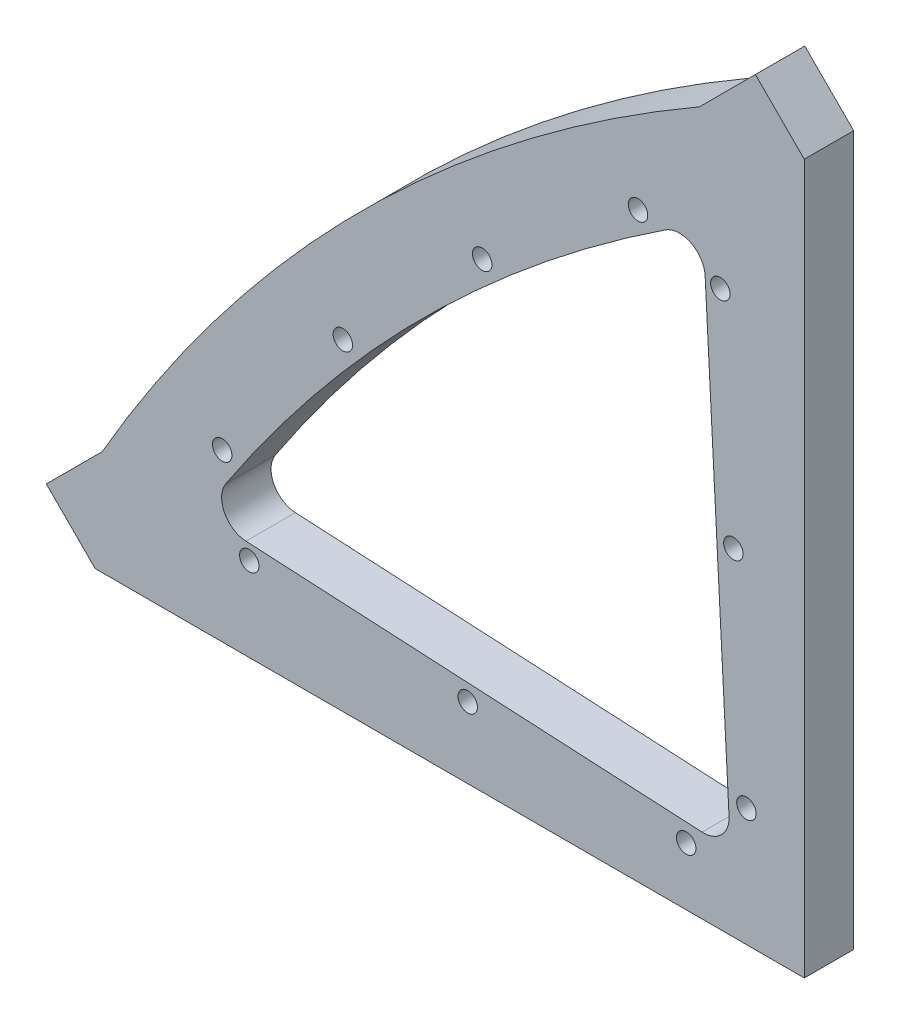
ISO-10303-21;
HEADER;
FILE_DESCRIPTION(('STEP AP214'),'2;1');
FILE_NAME('part.step','',(''),(''),'','','');
FILE_SCHEMA(('AUTOMOTIVE_DESIGN { 1 0 10303 214 1 1 1 1 }'));
ENDSEC;
DATA;
#1=APPLICATION_CONTEXT('core data for automotive mechanical design processes');
#2=APPLICATION_PROTOCOL_DEFINITION('international standard','automotive_design',2000,#1);
#3=PRODUCT_CONTEXT('',#1,'mechanical');
#4=PRODUCT('Part','Part','',(#3));
#5=PRODUCT_RELATED_PRODUCT_CATEGORY('part','',(#4));
#6=PRODUCT_DEFINITION_FORMATION('','',#4);
#7=PRODUCT_DEFINITION_CONTEXT('part definition',#1,'design');
#8=PRODUCT_DEFINITION('design','',#6,#7);
#9=PRODUCT_DEFINITION_SHAPE('','',#8);
#10=(LENGTH_UNIT() NAMED_UNIT(*) SI_UNIT(.MILLI.,.METRE.));
#11=(NAMED_UNIT(*) PLANE_ANGLE_UNIT() SI_UNIT($,.RADIAN.));
#12=(NAMED_UNIT(*) SI_UNIT($,.STERADIAN.) SOLID_ANGLE_UNIT());
#13=UNCERTAINTY_MEASURE_WITH_UNIT(LENGTH_MEASURE(1.E-05),#10,'distance_accuracy_value','');
#14=(GEOMETRIC_REPRESENTATION_CONTEXT(3) GLOBAL_UNCERTAINTY_ASSIGNED_CONTEXT((#13)) GLOBAL_UNIT_ASSIGNED_CONTEXT((#10,
#11,#12)) REPRESENTATION_CONTEXT('',''));
#15=CARTESIAN_POINT('',(0.,0.,0.));
#16=DIRECTION('',(0.,0.,1.));
#17=DIRECTION('',(1.,0.,0.));
#18=AXIS2_PLACEMENT_3D('',#15,#16,#17);
#19=CARTESIAN_POINT('',(109.464422667226,108.781938142239,12.7));
#20=DIRECTION('',(-0.707106781186546,-0.707106781186549,0.));
#21=DIRECTION('',(0.707106781186549,-0.707106781186546,0.));
#22=AXIS2_PLACEMENT_3D('',#19,#20,#21);
#23=PLANE('',#22);
#24=DIRECTION('',(-0.707106781186549,0.707106781186546,0.));
#25=VECTOR('',#24,1.);
#26=CARTESIAN_POINT('',(109.464422667226,108.781938142239,0.));
#27=LINE('',#26,#25);
#28=CARTESIAN_POINT('',(122.036781236723,96.2095795727423,0.));
#29=VERTEX_POINT('',#28);
#30=CARTESIAN_POINT('',(109.464422667226,108.781938142239,0.));
#31=VERTEX_POINT('',#30);
#32=EDGE_CURVE('E182',#29,#31,#27,.T.);
#33=ORIENTED_EDGE('',*,*,#32,.T.);
#34=DIRECTION('',(0.,0.,-1.));
#35=VECTOR('',#34,1.);
#36=CARTESIAN_POINT('',(109.464422667226,108.781938142239,12.7));
#37=LINE('',#36,#35);
#38=CARTESIAN_POINT('',(109.464422667226,108.781938142239,12.7));
#39=VERTEX_POINT('',#38);
#40=EDGE_CURVE('E11',#39,#31,#37,.T.);
#41=ORIENTED_EDGE('',*,*,#40,.F.);
#42=DIRECTION('',(-0.707106781186549,0.707106781186546,0.));
#43=VECTOR('',#42,1.);
#44=CARTESIAN_POINT('',(109.464422667226,108.781938142239,12.7));
#45=LINE('',#44,#43);
#46=CARTESIAN_POINT('',(122.036781236723,96.2095795727423,12.7));
#47=VERTEX_POINT('',#46);
#48=EDGE_CURVE('E190',#47,#39,#45,.T.);
#49=ORIENTED_EDGE('',*,*,#48,.F.);
#50=DIRECTION('',(0.,0.,-1.));
#51=VECTOR('',#50,1.);
#52=CARTESIAN_POINT('',(122.036781236723,96.2095795727423,12.7));
#53=LINE('',#52,#51);
#54=EDGE_CURVE('E206',#47,#29,#53,.T.);
#55=ORIENTED_EDGE('',*,*,#54,.T.);
#56=EDGE_LOOP('',(#33,#41,#49,#55));
#57=FACE_BOUND('',#56,.T.);
#58=ADVANCED_FACE('F39',(#57),#23,.F.);
#59=CARTESIAN_POINT('',(95.0960128735152,94.4135283485285,12.7));
#60=DIRECTION('',(0.707106781186548,-0.707106781186548,0.));
#61=DIRECTION('',(0.707106781186548,0.707106781186548,0.));
#62=AXIS2_PLACEMENT_3D('',#59,#60,#61);
#63=PLANE('',#62);
#64=DIRECTION('',(-0.707106781186547,-0.707106781186547,0.));
#65=VECTOR('',#64,1.);
#66=CARTESIAN_POINT('',(95.0960128735152,94.4135283485285,0.));
#67=LINE('',#66,#65);
#68=CARTESIAN_POINT('',(95.0960128735152,94.4135283485285,0.));
#69=VERTEX_POINT('',#68);
#70=EDGE_CURVE('E209',#31,#69,#67,.T.);
#71=ORIENTED_EDGE('',*,*,#70,.T.);
#72=DIRECTION('',(0.,0.,-1.));
#73=VECTOR('',#72,1.);
#74=CARTESIAN_POINT('',(95.0960128735152,94.4135283485285,12.7));
#75=LINE('',#74,#73);
#76=CARTESIAN_POINT('',(95.0960128735152,94.4135283485285,12.7));
#77=VERTEX_POINT('',#76);
#78=EDGE_CURVE('E46',#77,#69,#75,.T.);
#79=ORIENTED_EDGE('',*,*,#78,.F.);
#80=DIRECTION('',(-0.707106781186547,-0.707106781186547,0.));
#81=VECTOR('',#80,1.);
#82=CARTESIAN_POINT('',(95.0960128735152,94.4135283485285,12.7));
#83=LINE('',#82,#81);
#84=EDGE_CURVE('E193',#39,#77,#83,.T.);
#85=ORIENTED_EDGE('',*,*,#84,.F.);
#86=ORIENTED_EDGE('',*,*,#40,.T.);
#87=EDGE_LOOP('',(#71,#79,#85,#86));
#88=FACE_BOUND('',#87,.T.);
#89=ADVANCED_FACE('F259',(#88),#63,.F.);
#90=CARTESIAN_POINT('',(304.254749985464,-268.307588433703,12.7));
#91=DIRECTION('',(0.,0.,-1.));
#92=DIRECTION('',(-1.,0.,0.));
#93=AXIS2_PLACEMENT_3D('',#90,#91,#92);
#94=CYLINDRICAL_SURFACE('',#93,418.705129978144);
#95=CARTESIAN_POINT('',(304.254749985464,-268.307588433703,0.));
#96=DIRECTION('',(0.,0.,1.));
#97=DIRECTION('',(1.,0.,0.));
#98=AXIS2_PLACEMENT_3D('',#95,#96,#97);
#99=CIRCLE('',#98,418.705129978144);
#100=CARTESIAN_POINT('',(-58.4663667967675,-59.1488513217542,0.));
#101=VERTEX_POINT('',#100);
#102=EDGE_CURVE('E211',#69,#101,#99,.T.);
#103=ORIENTED_EDGE('',*,*,#102,.T.);
#104=DIRECTION('',(0.,0.,-1.));
#105=VECTOR('',#104,1.);
#106=CARTESIAN_POINT('',(-58.4663667967675,-59.1488513217542,12.7));
#107=LINE('',#106,#105);
#108=CARTESIAN_POINT('',(-58.4663667967675,-59.1488513217542,12.7));
#109=VERTEX_POINT('',#108);
#110=EDGE_CURVE('E231',#109,#101,#107,.T.);
#111=ORIENTED_EDGE('',*,*,#110,.F.);
#112=CARTESIAN_POINT('',(304.254749985464,-268.307588433703,12.7));
#113=DIRECTION('',(0.,0.,1.));
#114=DIRECTION('',(1.,0.,0.));
#115=AXIS2_PLACEMENT_3D('',#112,#113,#114);
#116=CIRCLE('',#115,418.705129978144);
#117=EDGE_CURVE('E196',#77,#109,#116,.T.);
#118=ORIENTED_EDGE('',*,*,#117,.F.);
#119=ORIENTED_EDGE('',*,*,#78,.T.);
#120=EDGE_LOOP('',(#103,#111,#118,#119));
#121=FACE_BOUND('',#120,.T.);
#122=ADVANCED_FACE('F238',(#121),#94,.T.);
#123=CARTESIAN_POINT('',(-58.4663667967675,-59.1488513217543,12.7));
#124=DIRECTION('',(0.707106781186548,-0.707106781186548,0.));
#125=DIRECTION('',(0.707106781186548,0.707106781186548,0.));
#126=AXIS2_PLACEMENT_3D('',#123,#124,#125);
#127=PLANE('',#126);
#128=DIRECTION('',(-0.707106781186548,-0.707106781186548,0.));
#129=VECTOR('',#128,1.);
#130=CARTESIAN_POINT('',(-58.4663667967675,-59.1488513217543,0.));
#131=LINE('',#130,#129);
#132=CARTESIAN_POINT('',(-72.8347765904782,-73.5172611154649,0.));
#133=VERTEX_POINT('',#132);
#134=EDGE_CURVE('E213',#101,#133,#131,.T.);
#135=ORIENTED_EDGE('',*,*,#134,.T.);
#136=DIRECTION('',(0.,0.,-1.));
#137=VECTOR('',#136,1.);
#138=CARTESIAN_POINT('',(-72.8347765904782,-73.5172611154649,12.7));
#139=LINE('',#138,#137);
#140=CARTESIAN_POINT('',(-72.8347765904782,-73.5172611154649,12.7));
#141=VERTEX_POINT('',#140);
#142=EDGE_CURVE('E228',#141,#133,#139,.T.);
#143=ORIENTED_EDGE('',*,*,#142,.F.);
#144=DIRECTION('',(-0.707106781186548,-0.707106781186548,0.));
#145=VECTOR('',#144,1.);
#146=CARTESIAN_POINT('',(-58.4663667967675,-59.1488513217543,12.7));
#147=LINE('',#146,#145);
#148=EDGE_CURVE('E198',#109,#141,#147,.T.);
#149=ORIENTED_EDGE('',*,*,#148,.F.);
#150=ORIENTED_EDGE('',*,*,#110,.T.);
#151=EDGE_LOOP('',(#135,#143,#149,#150));
#152=FACE_BOUND('',#151,.T.);
#153=ADVANCED_FACE('F247',(#152),#127,.F.);
#154=CARTESIAN_POINT('',(-72.8347765904782,-73.5172611154649,12.7));
#155=DIRECTION('',(0.707106781186548,0.707106781186548,0.));
#156=DIRECTION('',(-0.707106781186548,0.707106781186548,0.));
#157=AXIS2_PLACEMENT_3D('',#154,#155,#156);
#158=PLANE('',#157);
#159=DIRECTION('',(0.707106781186548,-0.707106781186548,0.));
#160=VECTOR('',#159,1.);
#161=CARTESIAN_POINT('',(-72.8347765904782,-73.5172611154649,0.));
#162=LINE('',#161,#160);
#163=CARTESIAN_POINT('',(-60.2624180209813,-86.0896196849618,0.));
#164=VERTEX_POINT('',#163);
#165=EDGE_CURVE('E215',#133,#164,#162,.T.);
#166=ORIENTED_EDGE('',*,*,#165,.T.);
#167=DIRECTION('',(0.,0.,-1.));
#168=VECTOR('',#167,1.);
#169=CARTESIAN_POINT('',(-60.2624180209813,-86.0896196849618,12.7));
#170=LINE('',#169,#168);
#171=CARTESIAN_POINT('',(-60.2624180209813,-86.0896196849618,12.7));
#172=VERTEX_POINT('',#171);
#173=EDGE_CURVE('E225',#172,#164,#170,.T.);
#174=ORIENTED_EDGE('',*,*,#173,.F.);
#175=DIRECTION('',(0.707106781186548,-0.707106781186548,0.));
#176=VECTOR('',#175,1.);
#177=CARTESIAN_POINT('',(-72.8347765904782,-73.5172611154649,12.7));
#178=LINE('',#177,#176);
#179=EDGE_CURVE('E200',#141,#172,#178,.T.);
#180=ORIENTED_EDGE('',*,*,#179,.F.);
#181=ORIENTED_EDGE('',*,*,#142,.T.);
#182=EDGE_LOOP('',(#166,#174,#180,#181));
#183=FACE_BOUND('',#182,.T.);
#184=ADVANCED_FACE('F251',(#183),#158,.F.);
#185=CARTESIAN_POINT('',(-60.2624180209813,-86.0896196849618,12.7));
#186=DIRECTION('',(0.,1.,0.));
#187=DIRECTION('',(0.,0.,1.));
#188=AXIS2_PLACEMENT_3D('',#185,#186,#187);
#189=PLANE('',#188);
#190=DIRECTION('',(1.,0.,0.));
#191=VECTOR('',#190,1.);
#192=CARTESIAN_POINT('',(-60.2624180209813,-86.0896196849618,0.));
#193=LINE('',#192,#191);
#194=CARTESIAN_POINT('',(122.036781236723,-86.0896196849618,0.));
#195=VERTEX_POINT('',#194);
#196=EDGE_CURVE('E217',#164,#195,#193,.T.);
#197=ORIENTED_EDGE('',*,*,#196,.T.);
#198=DIRECTION('',(0.,0.,-1.));
#199=VECTOR('',#198,1.);
#200=CARTESIAN_POINT('',(122.036781236723,-86.0896196849618,12.7));
#201=LINE('',#200,#199);
#202=CARTESIAN_POINT('',(122.036781236723,-86.0896196849618,12.7));
#203=VERTEX_POINT('',#202);
#204=EDGE_CURVE('E222',#203,#195,#201,.T.);
#205=ORIENTED_EDGE('',*,*,#204,.F.);
#206=DIRECTION('',(1.,0.,0.));
#207=VECTOR('',#206,1.);
#208=CARTESIAN_POINT('',(-60.2624180209813,-86.0896196849618,12.7));
#209=LINE('',#208,#207);
#210=EDGE_CURVE('E202',#172,#203,#209,.T.);
#211=ORIENTED_EDGE('',*,*,#210,.F.);
#212=ORIENTED_EDGE('',*,*,#173,.T.);
#213=EDGE_LOOP('',(#197,#205,#211,#212));
#214=FACE_BOUND('',#213,.T.);
#215=ADVANCED_FACE('F267',(#214),#189,.F.);
#216=CARTESIAN_POINT('',(122.036781236723,96.2095795727423,12.7));
#217=DIRECTION('',(-1.,0.,0.));
#218=DIRECTION('',(0.,-1.,0.));
#219=AXIS2_PLACEMENT_3D('',#216,#217,#218);
#220=PLANE('',#219);
#221=DIRECTION('',(0.,1.,0.));
#222=VECTOR('',#221,1.);
#223=CARTESIAN_POINT('',(122.036781236723,96.2095795727423,0.));
#224=LINE('',#223,#222);
#225=EDGE_CURVE('E194',#195,#29,#224,.T.);
#226=ORIENTED_EDGE('',*,*,#225,.T.);
#227=ORIENTED_EDGE('',*,*,#54,.F.);
#228=DIRECTION('',(0.,1.,0.));
#229=VECTOR('',#228,1.);
#230=CARTESIAN_POINT('',(122.036781236723,96.2095795727423,12.7));
#231=LINE('',#230,#229);
#232=EDGE_CURVE('E204',#203,#47,#231,.T.);
#233=ORIENTED_EDGE('',*,*,#232,.F.);
#234=ORIENTED_EDGE('',*,*,#204,.T.);
#235=EDGE_LOOP('',(#226,#227,#233,#234));
#236=FACE_BOUND('',#235,.T.);
#237=ADVANCED_FACE('F264',(#236),#220,.F.);
#238=CARTESIAN_POINT('',(304.254749985464,-268.307588433703,12.7));
#239=DIRECTION('',(0.,0.,1.));
#240=DIRECTION('',(1.,0.,0.));
#241=AXIS2_PLACEMENT_3D('',#238,#239,#240);
#242=PLANE('',#241);
#243=CARTESIAN_POINT('',(79.2876035932814,63.568690871037,12.7));
#244=DIRECTION('',(0.,0.,-1.));
#245=DIRECTION('',(-1.,0.,0.));
#246=AXIS2_PLACEMENT_3D('',#243,#244,#245);
#247=CIRCLE('',#246,2.50000000000001);
#248=CARTESIAN_POINT('',(76.7876035932814,63.568690871037,12.7));
#249=VERTEX_POINT('',#248);
#250=EDGE_CURVE('E485',#249,#249,#247,.T.);
#251=ORIENTED_EDGE('',*,*,#250,.T.);
#252=EDGE_LOOP('',(#251));
#253=FACE_BOUND('',#252,.T.);
#254=CARTESIAN_POINT('',(39.2281163146264,32.5461387596024,12.7));
#255=DIRECTION('',(0.,0.,-1.));
#256=DIRECTION('',(-1.,0.,0.));
#257=AXIS2_PLACEMENT_3D('',#254,#255,#256);
#258=CIRCLE('',#257,2.5);
#259=CARTESIAN_POINT('',(36.7281163146264,32.5461387596024,12.7));
#260=VERTEX_POINT('',#259);
#261=EDGE_CURVE('E499',#260,#260,#258,.T.);
#262=ORIENTED_EDGE('',*,*,#261,.T.);
#263=EDGE_LOOP('',(#262));
#264=FACE_BOUND('',#263,.T.);
#265=CARTESIAN_POINT('',(3.40102279215808,-3.28095476286611,12.7));
#266=DIRECTION('',(0.,0.,-1.));
#267=DIRECTION('',(-1.,0.,0.));
#268=AXIS2_PLACEMENT_3D('',#265,#266,#267);
#269=CIRCLE('',#268,2.5);
#270=CARTESIAN_POINT('',(0.901022792158078,-3.28095476286611,12.7));
#271=VERTEX_POINT('',#270);
#272=EDGE_CURVE('E505',#271,#271,#269,.T.);
#273=ORIENTED_EDGE('',*,*,#272,.T.);
#274=EDGE_LOOP('',(#273));
#275=FACE_BOUND('',#274,.T.);
#276=CARTESIAN_POINT('',(-27.621529319277,-43.3404420415208,12.7));
#277=DIRECTION('',(0.,0.,-1.));
#278=DIRECTION('',(-1.,0.,0.));
#279=AXIS2_PLACEMENT_3D('',#276,#277,#278);
#280=CIRCLE('',#279,2.5);
#281=CARTESIAN_POINT('',(-30.121529319277,-43.3404420415208,12.7));
#282=VERTEX_POINT('',#281);
#283=EDGE_CURVE('E511',#282,#282,#280,.T.);
#284=ORIENTED_EDGE('',*,*,#283,.T.);
#285=EDGE_LOOP('',(#284));
#286=FACE_BOUND('',#285,.T.);
#287=CARTESIAN_POINT('',(-20.6525086420682,-64.5024081574926,12.7));
#288=DIRECTION('',(0.,0.,-1.));
#289=DIRECTION('',(-1.,0.,0.));
#290=AXIS2_PLACEMENT_3D('',#287,#288,#289);
#291=CIRCLE('',#290,2.5);
#292=CARTESIAN_POINT('',(-23.1525086420682,-64.5024081574926,12.7));
#293=VERTEX_POINT('',#292);
#294=EDGE_CURVE('E517',#293,#293,#291,.T.);
#295=ORIENTED_EDGE('',*,*,#294,.T.);
#296=EDGE_LOOP('',(#295));
#297=FACE_BOUND('',#296,.T.);
#298=CARTESIAN_POINT('',(35.5084458983341,-67.8561085184183,12.7));
#299=DIRECTION('',(0.,0.,-1.));
#300=DIRECTION('',(-1.,0.,0.));
#301=AXIS2_PLACEMENT_3D('',#298,#299,#300);
#302=CIRCLE('',#301,2.5);
#303=CARTESIAN_POINT('',(33.0084458983341,-67.8561085184183,12.7));
#304=VERTEX_POINT('',#303);
#305=EDGE_CURVE('E523',#304,#304,#302,.T.);
#306=ORIENTED_EDGE('',*,*,#305,.T.);
#307=EDGE_LOOP('',(#306));
#308=FACE_BOUND('',#307,.T.);
#309=CARTESIAN_POINT('',(91.6694004387363,-71.2098088793439,12.7));
#310=DIRECTION('',(0.,0.,-1.));
#311=DIRECTION('',(-1.,0.,0.));
#312=AXIS2_PLACEMENT_3D('',#309,#310,#311);
#313=CIRCLE('',#312,2.5);
#314=CARTESIAN_POINT('',(89.1694004387363,-71.2098088793439,12.7));
#315=VERTEX_POINT('',#314);
#316=EDGE_CURVE('E529',#315,#315,#313,.T.);
#317=ORIENTED_EDGE('',*,*,#316,.T.);
#318=EDGE_LOOP('',(#317));
#319=FACE_BOUND('',#318,.T.);
#320=CARTESIAN_POINT('',(107.156970431104,-55.7222388869764,12.7));
#321=DIRECTION('',(0.,0.,-1.));
#322=DIRECTION('',(-1.,0.,0.));
#323=AXIS2_PLACEMENT_3D('',#320,#321,#322);
#324=CIRCLE('',#323,2.5);
#325=CARTESIAN_POINT('',(104.656970431104,-55.7222388869764,12.7));
#326=VERTEX_POINT('',#325);
#327=EDGE_CURVE('E535',#326,#326,#324,.T.);
#328=ORIENTED_EDGE('',*,*,#327,.T.);
#329=EDGE_LOOP('',(#328));
#330=FACE_BOUND('',#329,.T.);
#331=CARTESIAN_POINT('',(103.803270070179,0.43871565342582,12.7));
#332=DIRECTION('',(0.,0.,-1.));
#333=DIRECTION('',(-1.,0.,0.));
#334=AXIS2_PLACEMENT_3D('',#331,#332,#333);
#335=CIRCLE('',#334,2.50000000000001);
#336=CARTESIAN_POINT('',(101.303270070179,0.43871565342582,12.7));
#337=VERTEX_POINT('',#336);
#338=EDGE_CURVE('E494',#337,#337,#335,.T.);
#339=ORIENTED_EDGE('',*,*,#338,.T.);
#340=EDGE_LOOP('',(#339));
#341=FACE_BOUND('',#340,.T.);
#342=CARTESIAN_POINT('',(100.449569709253,56.5996701938281,12.7));
#343=DIRECTION('',(0.,0.,-1.));
#344=DIRECTION('',(-1.,0.,0.));
#345=AXIS2_PLACEMENT_3D('',#342,#343,#344);
#346=CIRCLE('',#345,2.5);
#347=CARTESIAN_POINT('',(97.9495697092532,56.5996701938281,12.7));
#348=VERTEX_POINT('',#347);
#349=EDGE_CURVE('E170',#348,#348,#346,.T.);
#350=ORIENTED_EDGE('',*,*,#349,.T.);
#351=EDGE_LOOP('',(#350));
#352=FACE_BOUND('',#351,.T.);
#353=CARTESIAN_POINT('',(89.9534057588097,57.1016098976426,12.7));
#354=DIRECTION('',(0.,0.,1.));
#355=DIRECTION('',(-1.,0.,0.));
#356=AXIS2_PLACEMENT_3D('',#353,#354,#355);
#357=CIRCLE('',#356,6.604);
#358=CARTESIAN_POINT('',(96.5483552063288,57.447236552671,12.7));
#359=VERTEX_POINT('',#358);
#360=CARTESIAN_POINT('',(86.3211795854765,62.6170200388519,12.7));
#361=VERTEX_POINT('',#360);
#362=EDGE_CURVE('E53',#359,#361,#357,.T.);
#363=ORIENTED_EDGE('',*,*,#362,.F.);
#364=DIRECTION('',(-0.0523359562429436,0.998629534754574,0.));
#365=VECTOR('',#364,1.);
#366=CARTESIAN_POINT('',(96.5483552063288,57.447236552671,12.7));
#367=LINE('',#366,#365);
#368=CARTESIAN_POINT('',(102.693314786226,-59.8055771319118,12.7));
#369=VERTEX_POINT('',#368);
#370=EDGE_CURVE('E152',#369,#359,#367,.T.);
#371=ORIENTED_EDGE('',*,*,#370,.F.);
#372=CARTESIAN_POINT('',(96.0983653387067,-60.1512037869402,12.7));
#373=DIRECTION('',(0.,0.,1.));
#374=DIRECTION('',(1.,0.,0.));
#375=AXIS2_PLACEMENT_3D('',#372,#373,#374);
#376=CIRCLE('',#375,6.60400000000001);
#377=CARTESIAN_POINT('',(95.7527386836787,-66.7461532344594,12.7));
#378=VERTEX_POINT('',#377);
#379=EDGE_CURVE('E155',#378,#369,#376,.T.);
#380=ORIENTED_EDGE('',*,*,#379,.F.);
#381=DIRECTION('',(0.998629534754577,-0.0523359562428866,0.));
#382=VECTOR('',#381,1.);
#383=CARTESIAN_POINT('',(95.7527386836787,-66.7461532344594,12.7));
#384=LINE('',#383,#382);
#385=CARTESIAN_POINT('',(-21.5000750009108,-60.6011936545686,12.7));
#386=VERTEX_POINT('',#385);
#387=EDGE_CURVE('E175',#386,#378,#384,.T.);
#388=ORIENTED_EDGE('',*,*,#387,.F.);
#389=CARTESIAN_POINT('',(-21.1544483458822,-54.0062442070494,12.7));
#390=DIRECTION('',(0.,0.,1.));
#391=DIRECTION('',(-1.,0.,0.));
#392=AXIS2_PLACEMENT_3D('',#389,#390,#391);
#393=CIRCLE('',#392,6.604);
#394=CARTESIAN_POINT('',(-26.6698584870914,-50.3740180337164,12.7));
#395=VERTEX_POINT('',#394);
#396=EDGE_CURVE('E172',#395,#386,#393,.T.);
#397=ORIENTED_EDGE('',*,*,#396,.F.);
#398=CARTESIAN_POINT('',(304.254749985468,-268.307588433707,12.7));
#399=DIRECTION('',(0.,0.,1.));
#400=DIRECTION('',(-1.,0.,0.));
#401=AXIS2_PLACEMENT_3D('',#398,#399,#400);
#402=CIRCLE('',#401,396.240000000005);
#403=EDGE_CURVE('E169',#361,#395,#402,.T.);
#404=ORIENTED_EDGE('',*,*,#403,.F.);
#405=EDGE_LOOP('',(#363,#371,#380,#388,#397,#404));
#406=FACE_BOUND('',#405,.T.);
#407=ORIENTED_EDGE('',*,*,#48,.T.);
#408=ORIENTED_EDGE('',*,*,#84,.T.);
#409=ORIENTED_EDGE('',*,*,#117,.T.);
#410=ORIENTED_EDGE('',*,*,#148,.T.);
#411=ORIENTED_EDGE('',*,*,#179,.T.);
#412=ORIENTED_EDGE('',*,*,#210,.T.);
#413=ORIENTED_EDGE('',*,*,#232,.T.);
#414=EDGE_LOOP('',(#407,#408,#409,#410,#411,#412,#413));
#415=FACE_BOUND('',#414,.T.);
#416=ADVANCED_FACE('F255',(#253,#264,#275,#286,#297,#308,#319,#330,#341,#352,#406,#415),#242,.T.);
#417=CARTESIAN_POINT('',(304.254749985464,-268.307588433703,0.));
#418=DIRECTION('',(0.,0.,1.));
#419=DIRECTION('',(1.,0.,0.));
#420=AXIS2_PLACEMENT_3D('',#417,#418,#419);
#421=PLANE('',#420);
#422=CARTESIAN_POINT('',(79.2876035932814,63.568690871037,0.));
#423=DIRECTION('',(0.,0.,-1.));
#424=DIRECTION('',(-1.,0.,0.));
#425=AXIS2_PLACEMENT_3D('',#422,#423,#424);
#426=CIRCLE('',#425,2.50000000000001);
#427=CARTESIAN_POINT('',(76.7876035932814,63.568690871037,0.));
#428=VERTEX_POINT('',#427);
#429=EDGE_CURVE('E488',#428,#428,#426,.T.);
#430=ORIENTED_EDGE('',*,*,#429,.F.);
#431=EDGE_LOOP('',(#430));
#432=FACE_BOUND('',#431,.T.);
#433=CARTESIAN_POINT('',(39.2281163146264,32.5461387596024,0.));
#434=DIRECTION('',(0.,0.,-1.));
#435=DIRECTION('',(-1.,0.,0.));
#436=AXIS2_PLACEMENT_3D('',#433,#434,#435);
#437=CIRCLE('',#436,2.5);
#438=CARTESIAN_POINT('',(36.7281163146264,32.5461387596024,0.));
#439=VERTEX_POINT('',#438);
#440=EDGE_CURVE('E491',#439,#439,#437,.T.);
#441=ORIENTED_EDGE('',*,*,#440,.F.);
#442=EDGE_LOOP('',(#441));
#443=FACE_BOUND('',#442,.T.);
#444=CARTESIAN_POINT('',(3.40102279215808,-3.28095476286611,0.));
#445=DIRECTION('',(0.,0.,-1.));
#446=DIRECTION('',(-1.,0.,0.));
#447=AXIS2_PLACEMENT_3D('',#444,#445,#446);
#448=CIRCLE('',#447,2.5);
#449=CARTESIAN_POINT('',(0.901022792158078,-3.28095476286611,0.));
#450=VERTEX_POINT('',#449);
#451=EDGE_CURVE('E502',#450,#450,#448,.T.);
#452=ORIENTED_EDGE('',*,*,#451,.F.);
#453=EDGE_LOOP('',(#452));
#454=FACE_BOUND('',#453,.T.);
#455=CARTESIAN_POINT('',(-27.621529319277,-43.3404420415208,0.));
#456=DIRECTION('',(0.,0.,-1.));
#457=DIRECTION('',(-1.,0.,0.));
#458=AXIS2_PLACEMENT_3D('',#455,#456,#457);
#459=CIRCLE('',#458,2.5);
#460=CARTESIAN_POINT('',(-30.121529319277,-43.3404420415208,0.));
#461=VERTEX_POINT('',#460);
#462=EDGE_CURVE('E508',#461,#461,#459,.T.);
#463=ORIENTED_EDGE('',*,*,#462,.F.);
#464=EDGE_LOOP('',(#463));
#465=FACE_BOUND('',#464,.T.);
#466=CARTESIAN_POINT('',(-20.6525086420682,-64.5024081574926,0.));
#467=DIRECTION('',(0.,0.,-1.));
#468=DIRECTION('',(-1.,0.,0.));
#469=AXIS2_PLACEMENT_3D('',#466,#467,#468);
#470=CIRCLE('',#469,2.5);
#471=CARTESIAN_POINT('',(-23.1525086420682,-64.5024081574926,0.));
#472=VERTEX_POINT('',#471);
#473=EDGE_CURVE('E514',#472,#472,#470,.T.);
#474=ORIENTED_EDGE('',*,*,#473,.F.);
#475=EDGE_LOOP('',(#474));
#476=FACE_BOUND('',#475,.T.);
#477=CARTESIAN_POINT('',(35.5084458983341,-67.8561085184183,0.));
#478=DIRECTION('',(0.,0.,-1.));
#479=DIRECTION('',(-1.,0.,0.));
#480=AXIS2_PLACEMENT_3D('',#477,#478,#479);
#481=CIRCLE('',#480,2.5);
#482=CARTESIAN_POINT('',(33.0084458983341,-67.8561085184183,0.));
#483=VERTEX_POINT('',#482);
#484=EDGE_CURVE('E520',#483,#483,#481,.T.);
#485=ORIENTED_EDGE('',*,*,#484,.F.);
#486=EDGE_LOOP('',(#485));
#487=FACE_BOUND('',#486,.T.);
#488=CARTESIAN_POINT('',(91.6694004387363,-71.2098088793439,0.));
#489=DIRECTION('',(0.,0.,-1.));
#490=DIRECTION('',(-1.,0.,0.));
#491=AXIS2_PLACEMENT_3D('',#488,#489,#490);
#492=CIRCLE('',#491,2.5);
#493=CARTESIAN_POINT('',(89.1694004387363,-71.2098088793439,0.));
#494=VERTEX_POINT('',#493);
#495=EDGE_CURVE('E526',#494,#494,#492,.T.);
#496=ORIENTED_EDGE('',*,*,#495,.F.);
#497=EDGE_LOOP('',(#496));
#498=FACE_BOUND('',#497,.T.);
#499=CARTESIAN_POINT('',(107.156970431104,-55.7222388869764,0.));
#500=DIRECTION('',(0.,0.,-1.));
#501=DIRECTION('',(-1.,0.,0.));
#502=AXIS2_PLACEMENT_3D('',#499,#500,#501);
#503=CIRCLE('',#502,2.5);
#504=CARTESIAN_POINT('',(104.656970431104,-55.7222388869764,0.));
#505=VERTEX_POINT('',#504);
#506=EDGE_CURVE('E532',#505,#505,#503,.T.);
#507=ORIENTED_EDGE('',*,*,#506,.F.);
#508=EDGE_LOOP('',(#507));
#509=FACE_BOUND('',#508,.T.);
#510=CARTESIAN_POINT('',(103.803270070179,0.43871565342582,0.));
#511=DIRECTION('',(0.,0.,-1.));
#512=DIRECTION('',(-1.,0.,0.));
#513=AXIS2_PLACEMENT_3D('',#510,#511,#512);
#514=CIRCLE('',#513,2.50000000000001);
#515=CARTESIAN_POINT('',(101.303270070179,0.43871565342582,0.));
#516=VERTEX_POINT('',#515);
#517=EDGE_CURVE('E537',#516,#516,#514,.T.);
#518=ORIENTED_EDGE('',*,*,#517,.F.);
#519=EDGE_LOOP('',(#518));
#520=FACE_BOUND('',#519,.T.);
#521=CARTESIAN_POINT('',(100.449569709253,56.5996701938281,0.));
#522=DIRECTION('',(0.,0.,-1.));
#523=DIRECTION('',(-1.,0.,0.));
#524=AXIS2_PLACEMENT_3D('',#521,#522,#523);
#525=CIRCLE('',#524,2.5);
#526=CARTESIAN_POINT('',(97.9495697092532,56.5996701938281,0.));
#527=VERTEX_POINT('',#526);
#528=EDGE_CURVE('E158',#527,#527,#525,.T.);
#529=ORIENTED_EDGE('',*,*,#528,.F.);
#530=EDGE_LOOP('',(#529));
#531=FACE_BOUND('',#530,.T.);
#532=DIRECTION('',(-0.0523359562429436,0.998629534754574,0.));
#533=VECTOR('',#532,1.);
#534=CARTESIAN_POINT('',(96.5483552063288,57.447236552671,0.));
#535=LINE('',#534,#533);
#536=CARTESIAN_POINT('',(102.693314786226,-59.8055771319118,0.));
#537=VERTEX_POINT('',#536);
#538=CARTESIAN_POINT('',(96.5483552063288,57.447236552671,0.));
#539=VERTEX_POINT('',#538);
#540=EDGE_CURVE('E141',#537,#539,#535,.T.);
#541=ORIENTED_EDGE('',*,*,#540,.T.);
#542=CARTESIAN_POINT('',(89.9534057588097,57.1016098976426,0.));
#543=DIRECTION('',(0.,0.,1.));
#544=DIRECTION('',(-1.,0.,0.));
#545=AXIS2_PLACEMENT_3D('',#542,#543,#544);
#546=CIRCLE('',#545,6.604);
#547=CARTESIAN_POINT('',(86.3211795854765,62.6170200388519,0.));
#548=VERTEX_POINT('',#547);
#549=EDGE_CURVE('E135',#539,#548,#546,.T.);
#550=ORIENTED_EDGE('',*,*,#549,.T.);
#551=CARTESIAN_POINT('',(304.254749985468,-268.307588433707,0.));
#552=DIRECTION('',(0.,0.,1.));
#553=DIRECTION('',(-1.,0.,0.));
#554=AXIS2_PLACEMENT_3D('',#551,#552,#553);
#555=CIRCLE('',#554,396.240000000005);
#556=CARTESIAN_POINT('',(-26.6698584870914,-50.3740180337163,0.));
#557=VERTEX_POINT('',#556);
#558=EDGE_CURVE('E144',#548,#557,#555,.T.);
#559=ORIENTED_EDGE('',*,*,#558,.T.);
#560=CARTESIAN_POINT('',(-21.1544483458822,-54.0062442070494,0.));
#561=DIRECTION('',(0.,0.,1.));
#562=DIRECTION('',(-1.,0.,0.));
#563=AXIS2_PLACEMENT_3D('',#560,#561,#562);
#564=CIRCLE('',#563,6.604);
#565=CARTESIAN_POINT('',(-21.5000750009108,-60.6011936545686,0.));
#566=VERTEX_POINT('',#565);
#567=EDGE_CURVE('E61',#557,#566,#564,.T.);
#568=ORIENTED_EDGE('',*,*,#567,.T.);
#569=DIRECTION('',(0.998629534754577,-0.0523359562428866,0.));
#570=VECTOR('',#569,1.);
#571=CARTESIAN_POINT('',(95.7527386836787,-66.7461532344594,0.));
#572=LINE('',#571,#570);
#573=CARTESIAN_POINT('',(95.7527386836787,-66.7461532344594,0.));
#574=VERTEX_POINT('',#573);
#575=EDGE_CURVE('E162',#566,#574,#572,.T.);
#576=ORIENTED_EDGE('',*,*,#575,.T.);
#577=CARTESIAN_POINT('',(96.0983653387067,-60.1512037869402,0.));
#578=DIRECTION('',(0.,0.,1.));
#579=DIRECTION('',(1.,0.,0.));
#580=AXIS2_PLACEMENT_3D('',#577,#578,#579);
#581=CIRCLE('',#580,6.60400000000001);
#582=EDGE_CURVE('E165',#574,#537,#581,.T.);
#583=ORIENTED_EDGE('',*,*,#582,.T.);
#584=EDGE_LOOP('',(#541,#550,#559,#568,#576,#583));
#585=FACE_BOUND('',#584,.T.);
#586=ORIENTED_EDGE('',*,*,#32,.F.);
#587=ORIENTED_EDGE('',*,*,#225,.F.);
#588=ORIENTED_EDGE('',*,*,#196,.F.);
#589=ORIENTED_EDGE('',*,*,#165,.F.);
#590=ORIENTED_EDGE('',*,*,#134,.F.);
#591=ORIENTED_EDGE('',*,*,#102,.F.);
#592=ORIENTED_EDGE('',*,*,#70,.F.);
#593=EDGE_LOOP('',(#586,#587,#588,#589,#590,#591,#592));
#594=FACE_BOUND('',#593,.T.);
#595=ADVANCED_FACE('F148',(#432,#443,#454,#465,#476,#487,#498,#509,#520,#531,#585,#594),#421,.F.);
#596=CARTESIAN_POINT('',(89.9534057588097,57.1016098976426,0.));
#597=DIRECTION('',(0.,0.,1.));
#598=DIRECTION('',(1.,0.,0.));
#599=AXIS2_PLACEMENT_3D('',#596,#597,#598);
#600=CYLINDRICAL_SURFACE('',#599,6.604);
#601=ORIENTED_EDGE('',*,*,#362,.T.);
#602=DIRECTION('',(0.,0.,1.));
#603=VECTOR('',#602,1.);
#604=CARTESIAN_POINT('',(86.3211795854765,62.6170200388519,0.));
#605=LINE('',#604,#603);
#606=EDGE_CURVE('E131',#548,#361,#605,.T.);
#607=ORIENTED_EDGE('',*,*,#606,.F.);
#608=ORIENTED_EDGE('',*,*,#549,.F.);
#609=DIRECTION('',(0.,0.,1.));
#610=VECTOR('',#609,1.);
#611=CARTESIAN_POINT('',(96.5483552063288,57.447236552671,0.));
#612=LINE('',#611,#610);
#613=EDGE_CURVE('E180',#539,#359,#612,.T.);
#614=ORIENTED_EDGE('',*,*,#613,.T.);
#615=EDGE_LOOP('',(#601,#607,#608,#614));
#616=FACE_BOUND('',#615,.T.);
#617=ADVANCED_FACE('F133',(#616),#600,.F.);
#618=CARTESIAN_POINT('',(96.5483552063288,57.447236552671,0.));
#619=DIRECTION('',(0.998629534754574,0.0523359562429436,0.));
#620=DIRECTION('',(-0.0523359562429436,0.998629534754574,0.));
#621=AXIS2_PLACEMENT_3D('',#618,#619,#620);
#622=PLANE('',#621);
#623=ORIENTED_EDGE('',*,*,#370,.T.);
#624=ORIENTED_EDGE('',*,*,#613,.F.);
#625=ORIENTED_EDGE('',*,*,#540,.F.);
#626=DIRECTION('',(0.,0.,1.));
#627=VECTOR('',#626,1.);
#628=CARTESIAN_POINT('',(102.693314786226,-59.8055771319118,0.));
#629=LINE('',#628,#627);
#630=EDGE_CURVE('E183',#537,#369,#629,.T.);
#631=ORIENTED_EDGE('',*,*,#630,.T.);
#632=EDGE_LOOP('',(#623,#624,#625,#631));
#633=FACE_BOUND('',#632,.T.);
#634=ADVANCED_FACE('F335',(#633),#622,.F.);
#635=CARTESIAN_POINT('',(96.0983653387067,-60.1512037869402,0.));
#636=DIRECTION('',(0.,0.,1.));
#637=DIRECTION('',(1.,0.,0.));
#638=AXIS2_PLACEMENT_3D('',#635,#636,#637);
#639=CYLINDRICAL_SURFACE('',#638,6.60400000000001);
#640=ORIENTED_EDGE('',*,*,#379,.T.);
#641=ORIENTED_EDGE('',*,*,#630,.F.);
#642=ORIENTED_EDGE('',*,*,#582,.F.);
#643=DIRECTION('',(0.,0.,1.));
#644=VECTOR('',#643,1.);
#645=CARTESIAN_POINT('',(95.7527386836787,-66.7461532344594,0.));
#646=LINE('',#645,#644);
#647=EDGE_CURVE('E185',#574,#378,#646,.T.);
#648=ORIENTED_EDGE('',*,*,#647,.T.);
#649=EDGE_LOOP('',(#640,#641,#642,#648));
#650=FACE_BOUND('',#649,.T.);
#651=ADVANCED_FACE('F344',(#650),#639,.F.);
#652=CARTESIAN_POINT('',(95.7527386836787,-66.7461532344594,0.));
#653=DIRECTION('',(-0.0523359562428866,-0.998629534754577,0.));
#654=DIRECTION('',(0.998629534754577,-0.0523359562428866,0.));
#655=AXIS2_PLACEMENT_3D('',#652,#653,#654);
#656=PLANE('',#655);
#657=ORIENTED_EDGE('',*,*,#387,.T.);
#658=ORIENTED_EDGE('',*,*,#647,.F.);
#659=ORIENTED_EDGE('',*,*,#575,.F.);
#660=DIRECTION('',(0.,0.,1.));
#661=VECTOR('',#660,1.);
#662=CARTESIAN_POINT('',(-21.5000750009108,-60.6011936545686,0.));
#663=LINE('',#662,#661);
#664=EDGE_CURVE('E187',#566,#386,#663,.T.);
#665=ORIENTED_EDGE('',*,*,#664,.T.);
#666=EDGE_LOOP('',(#657,#658,#659,#665));
#667=FACE_BOUND('',#666,.T.);
#668=ADVANCED_FACE('F354',(#667),#656,.F.);
#669=CARTESIAN_POINT('',(-21.1544483458822,-54.0062442070494,0.));
#670=DIRECTION('',(0.,0.,1.));
#671=DIRECTION('',(1.,0.,0.));
#672=AXIS2_PLACEMENT_3D('',#669,#670,#671);
#673=CYLINDRICAL_SURFACE('',#672,6.604);
#674=ORIENTED_EDGE('',*,*,#396,.T.);
#675=ORIENTED_EDGE('',*,*,#664,.F.);
#676=ORIENTED_EDGE('',*,*,#567,.F.);
#677=DIRECTION('',(0.,0.,1.));
#678=VECTOR('',#677,1.);
#679=CARTESIAN_POINT('',(-26.6698584870914,-50.3740180337164,0.));
#680=LINE('',#679,#678);
#681=EDGE_CURVE('E140',#557,#395,#680,.T.);
#682=ORIENTED_EDGE('',*,*,#681,.T.);
#683=EDGE_LOOP('',(#674,#675,#676,#682));
#684=FACE_BOUND('',#683,.T.);
#685=ADVANCED_FACE('F364',(#684),#673,.F.);
#686=CARTESIAN_POINT('',(304.254749985468,-268.307588433707,0.));
#687=DIRECTION('',(0.,0.,1.));
#688=DIRECTION('',(1.,0.,0.));
#689=AXIS2_PLACEMENT_3D('',#686,#687,#688);
#690=CYLINDRICAL_SURFACE('',#689,396.240000000005);
#691=ORIENTED_EDGE('',*,*,#403,.T.);
#692=ORIENTED_EDGE('',*,*,#681,.F.);
#693=ORIENTED_EDGE('',*,*,#558,.F.);
#694=ORIENTED_EDGE('',*,*,#606,.T.);
#695=EDGE_LOOP('',(#691,#692,#693,#694));
#696=FACE_BOUND('',#695,.T.);
#697=ADVANCED_FACE('F145',(#696),#690,.F.);
#698=CARTESIAN_POINT('',(100.449569709253,56.5996701938281,12.7));
#699=DIRECTION('',(0.,0.,-1.));
#700=DIRECTION('',(-1.,0.,0.));
#701=AXIS2_PLACEMENT_3D('',#698,#699,#700);
#702=CYLINDRICAL_SURFACE('',#701,2.5);
#703=ORIENTED_EDGE('',*,*,#349,.F.);
#704=EDGE_LOOP('',(#703));
#705=FACE_BOUND('',#704,.T.);
#706=ORIENTED_EDGE('',*,*,#528,.T.);
#707=EDGE_LOOP('',(#706));
#708=FACE_BOUND('',#707,.T.);
#709=ADVANCED_FACE('F381',(#705,#708),#702,.F.);
#710=CARTESIAN_POINT('',(103.803270070179,0.43871565342582,12.7));
#711=DIRECTION('',(0.,0.,-1.));
#712=DIRECTION('',(-1.,0.,0.));
#713=AXIS2_PLACEMENT_3D('',#710,#711,#712);
#714=CYLINDRICAL_SURFACE('',#713,2.50000000000001);
#715=ORIENTED_EDGE('',*,*,#338,.F.);
#716=EDGE_LOOP('',(#715));
#717=FACE_BOUND('',#716,.T.);
#718=ORIENTED_EDGE('',*,*,#517,.T.);
#719=EDGE_LOOP('',(#718));
#720=FACE_BOUND('',#719,.T.);
#721=ADVANCED_FACE('F389',(#717,#720),#714,.F.);
#722=CARTESIAN_POINT('',(107.156970431104,-55.7222388869764,12.7));
#723=DIRECTION('',(0.,0.,-1.));
#724=DIRECTION('',(-1.,0.,0.));
#725=AXIS2_PLACEMENT_3D('',#722,#723,#724);
#726=CYLINDRICAL_SURFACE('',#725,2.5);
#727=ORIENTED_EDGE('',*,*,#327,.F.);
#728=EDGE_LOOP('',(#727));
#729=FACE_BOUND('',#728,.T.);
#730=ORIENTED_EDGE('',*,*,#506,.T.);
#731=EDGE_LOOP('',(#730));
#732=FACE_BOUND('',#731,.T.);
#733=ADVANCED_FACE('F399',(#729,#732),#726,.F.);
#734=CARTESIAN_POINT('',(91.6694004387363,-71.2098088793439,12.7));
#735=DIRECTION('',(0.,0.,-1.));
#736=DIRECTION('',(-1.,0.,0.));
#737=AXIS2_PLACEMENT_3D('',#734,#735,#736);
#738=CYLINDRICAL_SURFACE('',#737,2.5);
#739=ORIENTED_EDGE('',*,*,#316,.F.);
#740=EDGE_LOOP('',(#739));
#741=FACE_BOUND('',#740,.T.);
#742=ORIENTED_EDGE('',*,*,#495,.T.);
#743=EDGE_LOOP('',(#742));
#744=FACE_BOUND('',#743,.T.);
#745=ADVANCED_FACE('F409',(#741,#744),#738,.F.);
#746=CARTESIAN_POINT('',(35.5084458983341,-67.8561085184183,12.7));
#747=DIRECTION('',(0.,0.,-1.));
#748=DIRECTION('',(-1.,0.,0.));
#749=AXIS2_PLACEMENT_3D('',#746,#747,#748);
#750=CYLINDRICAL_SURFACE('',#749,2.5);
#751=ORIENTED_EDGE('',*,*,#305,.F.);
#752=EDGE_LOOP('',(#751));
#753=FACE_BOUND('',#752,.T.);
#754=ORIENTED_EDGE('',*,*,#484,.T.);
#755=EDGE_LOOP('',(#754));
#756=FACE_BOUND('',#755,.T.);
#757=ADVANCED_FACE('F419',(#753,#756),#750,.F.);
#758=CARTESIAN_POINT('',(-20.6525086420682,-64.5024081574926,12.7));
#759=DIRECTION('',(0.,0.,-1.));
#760=DIRECTION('',(-1.,0.,0.));
#761=AXIS2_PLACEMENT_3D('',#758,#759,#760);
#762=CYLINDRICAL_SURFACE('',#761,2.5);
#763=ORIENTED_EDGE('',*,*,#294,.F.);
#764=EDGE_LOOP('',(#763));
#765=FACE_BOUND('',#764,.T.);
#766=ORIENTED_EDGE('',*,*,#473,.T.);
#767=EDGE_LOOP('',(#766));
#768=FACE_BOUND('',#767,.T.);
#769=ADVANCED_FACE('F429',(#765,#768),#762,.F.);
#770=CARTESIAN_POINT('',(-27.621529319277,-43.3404420415208,12.7));
#771=DIRECTION('',(0.,0.,-1.));
#772=DIRECTION('',(-1.,0.,0.));
#773=AXIS2_PLACEMENT_3D('',#770,#771,#772);
#774=CYLINDRICAL_SURFACE('',#773,2.5);
#775=ORIENTED_EDGE('',*,*,#283,.F.);
#776=EDGE_LOOP('',(#775));
#777=FACE_BOUND('',#776,.T.);
#778=ORIENTED_EDGE('',*,*,#462,.T.);
#779=EDGE_LOOP('',(#778));
#780=FACE_BOUND('',#779,.T.);
#781=ADVANCED_FACE('F439',(#777,#780),#774,.F.);
#782=CARTESIAN_POINT('',(3.40102279215808,-3.28095476286611,12.7));
#783=DIRECTION('',(0.,0.,-1.));
#784=DIRECTION('',(-1.,0.,0.));
#785=AXIS2_PLACEMENT_3D('',#782,#783,#784);
#786=CYLINDRICAL_SURFACE('',#785,2.5);
#787=ORIENTED_EDGE('',*,*,#272,.F.);
#788=EDGE_LOOP('',(#787));
#789=FACE_BOUND('',#788,.T.);
#790=ORIENTED_EDGE('',*,*,#451,.T.);
#791=EDGE_LOOP('',(#790));
#792=FACE_BOUND('',#791,.T.);
#793=ADVANCED_FACE('F449',(#789,#792),#786,.F.);
#794=CARTESIAN_POINT('',(39.2281163146264,32.5461387596024,12.7));
#795=DIRECTION('',(0.,0.,-1.));
#796=DIRECTION('',(-1.,0.,0.));
#797=AXIS2_PLACEMENT_3D('',#794,#795,#796);
#798=CYLINDRICAL_SURFACE('',#797,2.5);
#799=ORIENTED_EDGE('',*,*,#261,.F.);
#800=EDGE_LOOP('',(#799));
#801=FACE_BOUND('',#800,.T.);
#802=ORIENTED_EDGE('',*,*,#440,.T.);
#803=EDGE_LOOP('',(#802));
#804=FACE_BOUND('',#803,.T.);
#805=ADVANCED_FACE('F459',(#801,#804),#798,.F.);
#806=CARTESIAN_POINT('',(79.2876035932814,63.568690871037,12.7));
#807=DIRECTION('',(0.,0.,-1.));
#808=DIRECTION('',(-1.,0.,0.));
#809=AXIS2_PLACEMENT_3D('',#806,#807,#808);
#810=CYLINDRICAL_SURFACE('',#809,2.50000000000001);
#811=ORIENTED_EDGE('',*,*,#250,.F.);
#812=EDGE_LOOP('',(#811));
#813=FACE_BOUND('',#812,.T.);
#814=ORIENTED_EDGE('',*,*,#429,.T.);
#815=EDGE_LOOP('',(#814));
#816=FACE_BOUND('',#815,.T.);
#817=ADVANCED_FACE('F469',(#813,#816),#810,.F.);
#818=CLOSED_SHELL('',(#58,#89,#122,#153,#184,#215,#237,#416,#595,#617,#634,#651,#668,#685,#697,
#709,#721,#733,#745,#757,#769,#781,#793,#805,#817));
#819=MANIFOLD_SOLID_BREP('B2',#818);
#820=ADVANCED_BREP_SHAPE_REPRESENTATION('',(#18,#819),#14);
#821=SHAPE_DEFINITION_REPRESENTATION(#9,#820);
ENDSEC;
END-ISO-10303-21;
